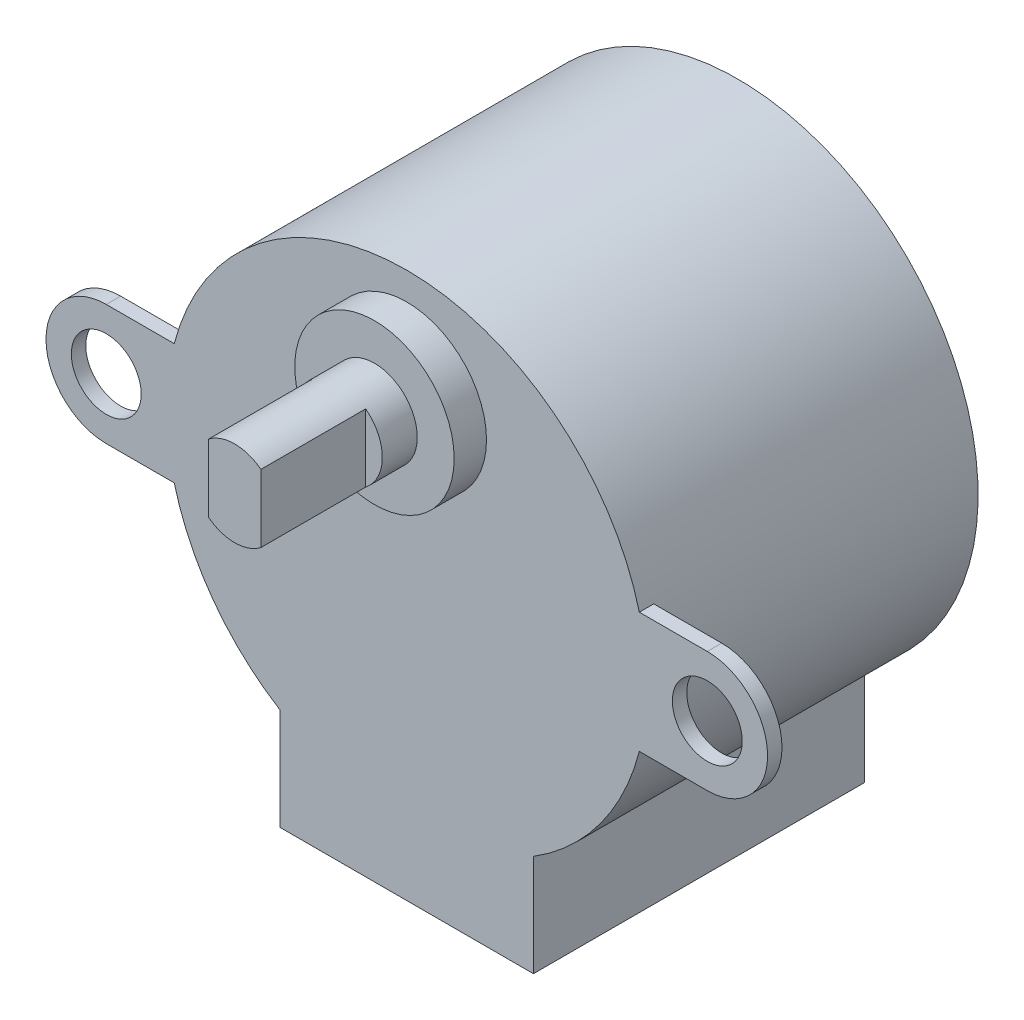
ISO-10303-21;
HEADER;
FILE_DESCRIPTION(('STEP AP214'),'2;1');
FILE_NAME('part.step','',(''),(''),'','','');
FILE_SCHEMA(('AUTOMOTIVE_DESIGN { 1 0 10303 214 1 1 1 1 }'));
ENDSEC;
DATA;
#1=APPLICATION_CONTEXT('core data for automotive mechanical design processes');
#2=APPLICATION_PROTOCOL_DEFINITION('international standard','automotive_design',2000,#1);
#3=PRODUCT_CONTEXT('',#1,'mechanical');
#4=PRODUCT('Part','Part','',(#3));
#5=PRODUCT_RELATED_PRODUCT_CATEGORY('part','',(#4));
#6=PRODUCT_DEFINITION_FORMATION('','',#4);
#7=PRODUCT_DEFINITION_CONTEXT('part definition',#1,'design');
#8=PRODUCT_DEFINITION('design','',#6,#7);
#9=PRODUCT_DEFINITION_SHAPE('','',#8);
#10=(LENGTH_UNIT() NAMED_UNIT(*) SI_UNIT(.MILLI.,.METRE.));
#11=(NAMED_UNIT(*) PLANE_ANGLE_UNIT() SI_UNIT($,.RADIAN.));
#12=(NAMED_UNIT(*) SI_UNIT($,.STERADIAN.) SOLID_ANGLE_UNIT());
#13=UNCERTAINTY_MEASURE_WITH_UNIT(LENGTH_MEASURE(1.E-05),#10,'distance_accuracy_value','');
#14=(GEOMETRIC_REPRESENTATION_CONTEXT(3) GLOBAL_UNCERTAINTY_ASSIGNED_CONTEXT((#13)) GLOBAL_UNIT_ASSIGNED_CONTEXT((#10,
#11,#12)) REPRESENTATION_CONTEXT('',''));
#15=CARTESIAN_POINT('',(0.,0.,0.));
#16=DIRECTION('',(0.,0.,1.));
#17=DIRECTION('',(1.,0.,0.));
#18=AXIS2_PLACEMENT_3D('',#15,#16,#17);
#19=CARTESIAN_POINT('',(7.366,-11.8702545886767,19.2532));
#20=DIRECTION('',(-1.,0.,0.));
#21=DIRECTION('',(0.,-1.,0.));
#22=AXIS2_PLACEMENT_3D('',#19,#20,#21);
#23=PLANE('',#22);
#24=DIRECTION('',(0.,1.,0.));
#25=VECTOR('',#24,1.);
#26=CARTESIAN_POINT('',(7.366,-11.8702545886767,0.));
#27=LINE('',#26,#25);
#28=CARTESIAN_POINT('',(7.366,-17.78,0.));
#29=VERTEX_POINT('',#28);
#30=CARTESIAN_POINT('',(7.36599999999999,-11.8702545886767,0.));
#31=VERTEX_POINT('',#30);
#32=EDGE_CURVE('E251',#29,#31,#27,.T.);
#33=ORIENTED_EDGE('',*,*,#32,.T.);
#34=DIRECTION('',(0.,0.,-1.));
#35=VECTOR('',#34,1.);
#36=CARTESIAN_POINT('',(7.36599999999999,-11.8702545886767,19.2532));
#37=LINE('',#36,#35);
#38=CARTESIAN_POINT('',(7.36599999999999,-11.8702545886767,19.2532));
#39=VERTEX_POINT('',#38);
#40=EDGE_CURVE('E35',#39,#31,#37,.T.);
#41=ORIENTED_EDGE('',*,*,#40,.F.);
#42=DIRECTION('',(0.,1.,0.));
#43=VECTOR('',#42,1.);
#44=CARTESIAN_POINT('',(7.366,-11.8702545886767,19.2532));
#45=LINE('',#44,#43);
#46=CARTESIAN_POINT('',(7.366,-17.78,19.2532));
#47=VERTEX_POINT('',#46);
#48=EDGE_CURVE('E258',#47,#39,#45,.T.);
#49=ORIENTED_EDGE('',*,*,#48,.F.);
#50=DIRECTION('',(0.,0.,-1.));
#51=VECTOR('',#50,1.);
#52=CARTESIAN_POINT('',(7.366,-17.78,19.2532));
#53=LINE('',#52,#51);
#54=EDGE_CURVE('E271',#47,#29,#53,.T.);
#55=ORIENTED_EDGE('',*,*,#54,.T.);
#56=EDGE_LOOP('',(#33,#41,#49,#55));
#57=FACE_BOUND('',#56,.T.);
#58=ADVANCED_FACE('F32',(#57),#23,.F.);
#59=CARTESIAN_POINT('',(0.,0.,19.2532));
#60=DIRECTION('',(0.,0.,-1.));
#61=DIRECTION('',(-1.,0.,0.));
#62=AXIS2_PLACEMENT_3D('',#59,#60,#61);
#63=CYLINDRICAL_SURFACE('',#62,13.97);
#64=CARTESIAN_POINT('',(0.,0.,19.2532));
#65=DIRECTION('',(0.,0.,1.));
#66=DIRECTION('',(1.,0.,0.));
#67=AXIS2_PLACEMENT_3D('',#64,#65,#66);
#68=CIRCLE('',#67,13.97);
#69=CARTESIAN_POINT('',(13.5231088496692,3.5051999999999,19.2532));
#70=VERTEX_POINT('',#69);
#71=CARTESIAN_POINT('',(-13.5231088496692,3.5051999999999,19.2532));
#72=VERTEX_POINT('',#71);
#73=EDGE_CURVE('E267',#70,#72,#68,.T.);
#74=ORIENTED_EDGE('',*,*,#73,.F.);
#75=DIRECTION('',(0.,0.,1.));
#76=VECTOR('',#75,1.);
#77=CARTESIAN_POINT('',(13.5231088496692,3.5051999999999,18.415));
#78=LINE('',#77,#76);
#79=CARTESIAN_POINT('',(13.5231088496692,3.5051999999999,18.415));
#80=VERTEX_POINT('',#79);
#81=EDGE_CURVE('E212',#80,#70,#78,.T.);
#82=ORIENTED_EDGE('',*,*,#81,.F.);
#83=CARTESIAN_POINT('',(0.,0.,18.415));
#84=DIRECTION('',(0.,0.,-1.));
#85=DIRECTION('',(-1.,0.,0.));
#86=AXIS2_PLACEMENT_3D('',#83,#84,#85);
#87=CIRCLE('',#86,13.97);
#88=CARTESIAN_POINT('',(13.5231088496691,-3.5052000000001,18.415));
#89=VERTEX_POINT('',#88);
#90=EDGE_CURVE('E192',#80,#89,#87,.T.);
#91=ORIENTED_EDGE('',*,*,#90,.T.);
#92=DIRECTION('',(0.,0.,1.));
#93=VECTOR('',#92,1.);
#94=CARTESIAN_POINT('',(13.5231088496691,-3.5052000000001,18.415));
#95=LINE('',#94,#93);
#96=CARTESIAN_POINT('',(13.5231088496691,-3.5052000000001,19.2532));
#97=VERTEX_POINT('',#96);
#98=EDGE_CURVE('E205',#89,#97,#95,.T.);
#99=ORIENTED_EDGE('',*,*,#98,.T.);
#100=EDGE_CURVE('E263',#39,#97,#68,.T.);
#101=ORIENTED_EDGE('',*,*,#100,.F.);
#102=ORIENTED_EDGE('',*,*,#40,.T.);
#103=CARTESIAN_POINT('',(0.,0.,0.));
#104=DIRECTION('',(0.,0.,1.));
#105=DIRECTION('',(1.,0.,0.));
#106=AXIS2_PLACEMENT_3D('',#103,#104,#105);
#107=CIRCLE('',#106,13.97);
#108=CARTESIAN_POINT('',(-7.366,-11.8702545886767,0.));
#109=VERTEX_POINT('',#108);
#110=EDGE_CURVE('E274',#31,#109,#107,.T.);
#111=ORIENTED_EDGE('',*,*,#110,.T.);
#112=DIRECTION('',(0.,0.,-1.));
#113=VECTOR('',#112,1.);
#114=CARTESIAN_POINT('',(-7.366,-11.8702545886767,19.2532));
#115=LINE('',#114,#113);
#116=CARTESIAN_POINT('',(-7.366,-11.8702545886767,19.2532));
#117=VERTEX_POINT('',#116);
#118=EDGE_CURVE('E283',#117,#109,#115,.T.);
#119=ORIENTED_EDGE('',*,*,#118,.F.);
#120=CARTESIAN_POINT('',(-13.5231088496691,-3.5052000000001,19.2532));
#121=VERTEX_POINT('',#120);
#122=EDGE_CURVE('E261',#121,#117,#68,.T.);
#123=ORIENTED_EDGE('',*,*,#122,.F.);
#124=DIRECTION('',(0.,0.,1.));
#125=VECTOR('',#124,1.);
#126=CARTESIAN_POINT('',(-13.5231088496691,-3.5052000000001,18.415));
#127=LINE('',#126,#125);
#128=CARTESIAN_POINT('',(-13.5231088496691,-3.5052000000001,18.415));
#129=VERTEX_POINT('',#128);
#130=EDGE_CURVE('E248',#129,#121,#127,.T.);
#131=ORIENTED_EDGE('',*,*,#130,.F.);
#132=CARTESIAN_POINT('',(0.,0.,18.415));
#133=DIRECTION('',(0.,0.,-1.));
#134=DIRECTION('',(1.,0.,0.));
#135=AXIS2_PLACEMENT_3D('',#132,#133,#134);
#136=CIRCLE('',#135,13.97);
#137=CARTESIAN_POINT('',(-13.5231088496692,3.5051999999999,18.415));
#138=VERTEX_POINT('',#137);
#139=EDGE_CURVE('E228',#129,#138,#136,.T.);
#140=ORIENTED_EDGE('',*,*,#139,.T.);
#141=DIRECTION('',(0.,0.,1.));
#142=VECTOR('',#141,1.);
#143=CARTESIAN_POINT('',(-13.5231088496692,3.5051999999999,18.415));
#144=LINE('',#143,#142);
#145=EDGE_CURVE('E241',#138,#72,#144,.T.);
#146=ORIENTED_EDGE('',*,*,#145,.T.);
#147=EDGE_LOOP('',(#74,#82,#91,#99,#101,#102,#111,#119,#123,#131,#140,#146));
#148=FACE_BOUND('',#147,.T.);
#149=ADVANCED_FACE('F293',(#148),#63,.T.);
#150=CARTESIAN_POINT('',(-7.366,-11.8702545886767,19.2532));
#151=DIRECTION('',(1.,0.,0.));
#152=DIRECTION('',(0.,1.,0.));
#153=AXIS2_PLACEMENT_3D('',#150,#151,#152);
#154=PLANE('',#153);
#155=DIRECTION('',(0.,-1.,0.));
#156=VECTOR('',#155,1.);
#157=CARTESIAN_POINT('',(-7.366,-11.8702545886767,0.));
#158=LINE('',#157,#156);
#159=CARTESIAN_POINT('',(-7.366,-17.78,0.));
#160=VERTEX_POINT('',#159);
#161=EDGE_CURVE('E276',#109,#160,#158,.T.);
#162=ORIENTED_EDGE('',*,*,#161,.T.);
#163=DIRECTION('',(0.,0.,-1.));
#164=VECTOR('',#163,1.);
#165=CARTESIAN_POINT('',(-7.366,-17.78,19.2532));
#166=LINE('',#165,#164);
#167=CARTESIAN_POINT('',(-7.366,-17.78,19.2532));
#168=VERTEX_POINT('',#167);
#169=EDGE_CURVE('E281',#168,#160,#166,.T.);
#170=ORIENTED_EDGE('',*,*,#169,.F.);
#171=DIRECTION('',(0.,-1.,0.));
#172=VECTOR('',#171,1.);
#173=CARTESIAN_POINT('',(-7.366,-11.8702545886767,19.2532));
#174=LINE('',#173,#172);
#175=EDGE_CURVE('E266',#117,#168,#174,.T.);
#176=ORIENTED_EDGE('',*,*,#175,.F.);
#177=ORIENTED_EDGE('',*,*,#118,.T.);
#178=EDGE_LOOP('',(#162,#170,#176,#177));
#179=FACE_BOUND('',#178,.T.);
#180=ADVANCED_FACE('F302',(#179),#154,.F.);
#181=CARTESIAN_POINT('',(-7.366,-17.78,19.2532));
#182=DIRECTION('',(0.,1.,0.));
#183=DIRECTION('',(0.,0.,1.));
#184=AXIS2_PLACEMENT_3D('',#181,#182,#183);
#185=PLANE('',#184);
#186=DIRECTION('',(1.,0.,0.));
#187=VECTOR('',#186,1.);
#188=CARTESIAN_POINT('',(-7.366,-17.78,0.));
#189=LINE('',#188,#187);
#190=EDGE_CURVE('E262',#160,#29,#189,.T.);
#191=ORIENTED_EDGE('',*,*,#190,.T.);
#192=ORIENTED_EDGE('',*,*,#54,.F.);
#193=DIRECTION('',(1.,0.,0.));
#194=VECTOR('',#193,1.);
#195=CARTESIAN_POINT('',(-7.366,-17.78,19.2532));
#196=LINE('',#195,#194);
#197=EDGE_CURVE('E269',#168,#47,#196,.T.);
#198=ORIENTED_EDGE('',*,*,#197,.F.);
#199=ORIENTED_EDGE('',*,*,#169,.T.);
#200=EDGE_LOOP('',(#191,#192,#198,#199));
#201=FACE_BOUND('',#200,.T.);
#202=ADVANCED_FACE('F305',(#201),#185,.F.);
#203=CARTESIAN_POINT('',(0.,0.,19.2532));
#204=DIRECTION('',(0.,0.,1.));
#205=DIRECTION('',(1.,0.,0.));
#206=AXIS2_PLACEMENT_3D('',#203,#204,#205);
#207=PLANE('',#206);
#208=CARTESIAN_POINT('',(0.,7.7343,19.2532));
#209=DIRECTION('',(0.,0.,1.));
#210=DIRECTION('',(1.,0.,0.));
#211=AXIS2_PLACEMENT_3D('',#208,#209,#210);
#212=CIRCLE('',#211,4.6355);
#213=CARTESIAN_POINT('',(4.6355,7.7343,19.2532));
#214=VERTEX_POINT('',#213);
#215=EDGE_CURVE('E178',#214,#214,#212,.T.);
#216=ORIENTED_EDGE('',*,*,#215,.F.);
#217=EDGE_LOOP('',(#216));
#218=FACE_BOUND('',#217,.T.);
#219=ORIENTED_EDGE('',*,*,#48,.T.);
#220=ORIENTED_EDGE('',*,*,#100,.T.);
#221=DIRECTION('',(1.,0.,0.));
#222=VECTOR('',#221,1.);
#223=CARTESIAN_POINT('',(13.5231088496691,-3.5052000000001,19.2532));
#224=LINE('',#223,#222);
#225=CARTESIAN_POINT('',(17.4752,-3.5052000000001,19.2532));
#226=VERTEX_POINT('',#225);
#227=EDGE_CURVE('E189',#97,#226,#224,.T.);
#228=ORIENTED_EDGE('',*,*,#227,.T.);
#229=CARTESIAN_POINT('',(17.4752,0.,19.2532));
#230=DIRECTION('',(0.,0.,1.));
#231=DIRECTION('',(-1.,0.,0.));
#232=AXIS2_PLACEMENT_3D('',#229,#230,#231);
#233=CIRCLE('',#232,3.5052);
#234=CARTESIAN_POINT('',(17.4752,3.5051999999999,19.2532));
#235=VERTEX_POINT('',#234);
#236=EDGE_CURVE('E208',#226,#235,#233,.T.);
#237=ORIENTED_EDGE('',*,*,#236,.T.);
#238=DIRECTION('',(-1.,0.,0.));
#239=VECTOR('',#238,1.);
#240=CARTESIAN_POINT('',(13.5231088496692,3.5051999999999,19.2532));
#241=LINE('',#240,#239);
#242=EDGE_CURVE('E196',#235,#70,#241,.T.);
#243=ORIENTED_EDGE('',*,*,#242,.T.);
#244=ORIENTED_EDGE('',*,*,#73,.T.);
#245=DIRECTION('',(-1.,0.,0.));
#246=VECTOR('',#245,1.);
#247=CARTESIAN_POINT('',(-13.5231088496692,3.5051999999999,19.2532));
#248=LINE('',#247,#246);
#249=CARTESIAN_POINT('',(-17.4752,3.5051999999999,19.2532));
#250=VERTEX_POINT('',#249);
#251=EDGE_CURVE('E225',#72,#250,#248,.T.);
#252=ORIENTED_EDGE('',*,*,#251,.T.);
#253=CARTESIAN_POINT('',(-17.4752,0.,19.2532));
#254=DIRECTION('',(0.,0.,1.));
#255=DIRECTION('',(1.,0.,0.));
#256=AXIS2_PLACEMENT_3D('',#253,#254,#255);
#257=CIRCLE('',#256,3.5052);
#258=CARTESIAN_POINT('',(-17.4752,-3.5052000000001,19.2532));
#259=VERTEX_POINT('',#258);
#260=EDGE_CURVE('E244',#250,#259,#257,.T.);
#261=ORIENTED_EDGE('',*,*,#260,.T.);
#262=DIRECTION('',(1.,0.,0.));
#263=VECTOR('',#262,1.);
#264=CARTESIAN_POINT('',(-13.5231088496691,-3.5052000000001,19.2532));
#265=LINE('',#264,#263);
#266=EDGE_CURVE('E232',#259,#121,#265,.T.);
#267=ORIENTED_EDGE('',*,*,#266,.T.);
#268=ORIENTED_EDGE('',*,*,#122,.T.);
#269=ORIENTED_EDGE('',*,*,#175,.T.);
#270=ORIENTED_EDGE('',*,*,#197,.T.);
#271=EDGE_LOOP('',(#219,#220,#228,#237,#243,#244,#252,#261,#267,#268,#269,#270));
#272=FACE_BOUND('',#271,.T.);
#273=CARTESIAN_POINT('',(-17.4752,0.,19.2532));
#274=DIRECTION('',(0.,0.,1.));
#275=DIRECTION('',(1.,0.,0.));
#276=AXIS2_PLACEMENT_3D('',#273,#274,#275);
#277=CIRCLE('',#276,2.032);
#278=CARTESIAN_POINT('',(-15.4432,0.,19.2532));
#279=VERTEX_POINT('',#278);
#280=EDGE_CURVE('E215',#279,#279,#277,.T.);
#281=ORIENTED_EDGE('',*,*,#280,.F.);
#282=EDGE_LOOP('',(#281));
#283=FACE_BOUND('',#282,.T.);
#284=CARTESIAN_POINT('',(17.4752,0.,19.2532));
#285=DIRECTION('',(0.,0.,1.));
#286=DIRECTION('',(-1.,0.,0.));
#287=AXIS2_PLACEMENT_3D('',#284,#285,#286);
#288=CIRCLE('',#287,2.032);
#289=CARTESIAN_POINT('',(15.4432,0.,19.2532));
#290=VERTEX_POINT('',#289);
#291=EDGE_CURVE('E183',#290,#290,#288,.T.);
#292=ORIENTED_EDGE('',*,*,#291,.F.);
#293=EDGE_LOOP('',(#292));
#294=FACE_BOUND('',#293,.T.);
#295=ADVANCED_FACE('F307',(#218,#272,#283,#294),#207,.T.);
#296=CARTESIAN_POINT('',(0.,0.,0.));
#297=DIRECTION('',(0.,0.,1.));
#298=DIRECTION('',(1.,0.,0.));
#299=AXIS2_PLACEMENT_3D('',#296,#297,#298);
#300=PLANE('',#299);
#301=ORIENTED_EDGE('',*,*,#32,.F.);
#302=ORIENTED_EDGE('',*,*,#190,.F.);
#303=ORIENTED_EDGE('',*,*,#161,.F.);
#304=ORIENTED_EDGE('',*,*,#110,.F.);
#305=EDGE_LOOP('',(#301,#302,#303,#304));
#306=FACE_BOUND('',#305,.T.);
#307=ADVANCED_FACE('F300',(#306),#300,.F.);
#308=CARTESIAN_POINT('',(-13.5231088496691,-3.5052000000001,18.415));
#309=DIRECTION('',(0.,-1.,0.));
#310=DIRECTION('',(1.,0.,0.));
#311=AXIS2_PLACEMENT_3D('',#308,#309,#310);
#312=PLANE('',#311);
#313=ORIENTED_EDGE('',*,*,#266,.F.);
#314=DIRECTION('',(0.,0.,1.));
#315=VECTOR('',#314,1.);
#316=CARTESIAN_POINT('',(-17.4752,-3.5052000000001,18.415));
#317=LINE('',#316,#315);
#318=CARTESIAN_POINT('',(-17.4752,-3.5052000000001,18.415));
#319=VERTEX_POINT('',#318);
#320=EDGE_CURVE('E252',#319,#259,#317,.T.);
#321=ORIENTED_EDGE('',*,*,#320,.F.);
#322=DIRECTION('',(1.,0.,0.));
#323=VECTOR('',#322,1.);
#324=CARTESIAN_POINT('',(-13.5231088496691,-3.5052000000001,18.415));
#325=LINE('',#324,#323);
#326=EDGE_CURVE('E238',#319,#129,#325,.T.);
#327=ORIENTED_EDGE('',*,*,#326,.T.);
#328=ORIENTED_EDGE('',*,*,#130,.T.);
#329=EDGE_LOOP('',(#313,#321,#327,#328));
#330=FACE_BOUND('',#329,.T.);
#331=ADVANCED_FACE('F324',(#330),#312,.T.);
#332=CARTESIAN_POINT('',(-17.4752,0.,18.415));
#333=DIRECTION('',(0.,0.,1.));
#334=DIRECTION('',(1.,0.,0.));
#335=AXIS2_PLACEMENT_3D('',#332,#333,#334);
#336=CYLINDRICAL_SURFACE('',#335,3.5052);
#337=ORIENTED_EDGE('',*,*,#260,.F.);
#338=DIRECTION('',(0.,0.,1.));
#339=VECTOR('',#338,1.);
#340=CARTESIAN_POINT('',(-17.4752,3.5051999999999,18.415));
#341=LINE('',#340,#339);
#342=CARTESIAN_POINT('',(-17.4752,3.5051999999999,18.415));
#343=VERTEX_POINT('',#342);
#344=EDGE_CURVE('E254',#343,#250,#341,.T.);
#345=ORIENTED_EDGE('',*,*,#344,.F.);
#346=CARTESIAN_POINT('',(-17.4752,0.,18.415));
#347=DIRECTION('',(0.,0.,1.));
#348=DIRECTION('',(1.,0.,0.));
#349=AXIS2_PLACEMENT_3D('',#346,#347,#348);
#350=CIRCLE('',#349,3.5052);
#351=EDGE_CURVE('E235',#343,#319,#350,.T.);
#352=ORIENTED_EDGE('',*,*,#351,.T.);
#353=ORIENTED_EDGE('',*,*,#320,.T.);
#354=EDGE_LOOP('',(#337,#345,#352,#353));
#355=FACE_BOUND('',#354,.T.);
#356=ADVANCED_FACE('F326',(#355),#336,.T.);
#357=CARTESIAN_POINT('',(-13.5231088496692,3.5051999999999,18.415));
#358=DIRECTION('',(0.,1.,0.));
#359=DIRECTION('',(-1.,0.,0.));
#360=AXIS2_PLACEMENT_3D('',#357,#358,#359);
#361=PLANE('',#360);
#362=ORIENTED_EDGE('',*,*,#251,.F.);
#363=ORIENTED_EDGE('',*,*,#145,.F.);
#364=DIRECTION('',(-1.,0.,0.));
#365=VECTOR('',#364,1.);
#366=CARTESIAN_POINT('',(-13.5231088496692,3.5051999999999,18.415));
#367=LINE('',#366,#365);
#368=EDGE_CURVE('E231',#138,#343,#367,.T.);
#369=ORIENTED_EDGE('',*,*,#368,.T.);
#370=ORIENTED_EDGE('',*,*,#344,.T.);
#371=EDGE_LOOP('',(#362,#363,#369,#370));
#372=FACE_BOUND('',#371,.T.);
#373=ADVANCED_FACE('F316',(#372),#361,.T.);
#374=CARTESIAN_POINT('',(0.,0.,18.415));
#375=DIRECTION('',(0.,0.,1.));
#376=DIRECTION('',(1.,0.,0.));
#377=AXIS2_PLACEMENT_3D('',#374,#375,#376);
#378=PLANE('',#377);
#379=CARTESIAN_POINT('',(-17.4752,0.,18.415));
#380=DIRECTION('',(0.,0.,1.));
#381=DIRECTION('',(1.,0.,0.));
#382=AXIS2_PLACEMENT_3D('',#379,#380,#381);
#383=CIRCLE('',#382,2.032);
#384=CARTESIAN_POINT('',(-15.4432,0.,18.415));
#385=VERTEX_POINT('',#384);
#386=EDGE_CURVE('E222',#385,#385,#383,.T.);
#387=ORIENTED_EDGE('',*,*,#386,.T.);
#388=EDGE_LOOP('',(#387));
#389=FACE_BOUND('',#388,.T.);
#390=ORIENTED_EDGE('',*,*,#139,.F.);
#391=ORIENTED_EDGE('',*,*,#326,.F.);
#392=ORIENTED_EDGE('',*,*,#351,.F.);
#393=ORIENTED_EDGE('',*,*,#368,.F.);
#394=EDGE_LOOP('',(#390,#391,#392,#393));
#395=FACE_BOUND('',#394,.T.);
#396=ADVANCED_FACE('F321',(#389,#395),#378,.F.);
#397=CARTESIAN_POINT('',(-17.4752,0.,18.415));
#398=DIRECTION('',(0.,0.,1.));
#399=DIRECTION('',(1.,0.,0.));
#400=AXIS2_PLACEMENT_3D('',#397,#398,#399);
#401=CYLINDRICAL_SURFACE('',#400,2.032);
#402=ORIENTED_EDGE('',*,*,#386,.F.);
#403=EDGE_LOOP('',(#402));
#404=FACE_BOUND('',#403,.T.);
#405=ORIENTED_EDGE('',*,*,#280,.T.);
#406=EDGE_LOOP('',(#405));
#407=FACE_BOUND('',#406,.T.);
#408=ADVANCED_FACE('F380',(#404,#407),#401,.F.);
#409=CARTESIAN_POINT('',(13.5231088496692,3.5051999999999,18.415));
#410=DIRECTION('',(0.,1.,0.));
#411=DIRECTION('',(-1.,0.,0.));
#412=AXIS2_PLACEMENT_3D('',#409,#410,#411);
#413=PLANE('',#412);
#414=ORIENTED_EDGE('',*,*,#242,.F.);
#415=DIRECTION('',(0.,0.,1.));
#416=VECTOR('',#415,1.);
#417=CARTESIAN_POINT('',(17.4752,3.5051999999999,18.415));
#418=LINE('',#417,#416);
#419=CARTESIAN_POINT('',(17.4752,3.5051999999999,18.415));
#420=VERTEX_POINT('',#419);
#421=EDGE_CURVE('E216',#420,#235,#418,.T.);
#422=ORIENTED_EDGE('',*,*,#421,.F.);
#423=DIRECTION('',(-1.,0.,0.));
#424=VECTOR('',#423,1.);
#425=CARTESIAN_POINT('',(13.5231088496692,3.5051999999999,18.415));
#426=LINE('',#425,#424);
#427=EDGE_CURVE('E202',#420,#80,#426,.T.);
#428=ORIENTED_EDGE('',*,*,#427,.T.);
#429=ORIENTED_EDGE('',*,*,#81,.T.);
#430=EDGE_LOOP('',(#414,#422,#428,#429));
#431=FACE_BOUND('',#430,.T.);
#432=ADVANCED_FACE('F376',(#431),#413,.T.);
#433=CARTESIAN_POINT('',(17.4752,0.,18.415));
#434=DIRECTION('',(0.,0.,1.));
#435=DIRECTION('',(1.,0.,0.));
#436=AXIS2_PLACEMENT_3D('',#433,#434,#435);
#437=CYLINDRICAL_SURFACE('',#436,3.5052);
#438=ORIENTED_EDGE('',*,*,#236,.F.);
#439=DIRECTION('',(0.,0.,1.));
#440=VECTOR('',#439,1.);
#441=CARTESIAN_POINT('',(17.4752,-3.5052000000001,18.415));
#442=LINE('',#441,#440);
#443=CARTESIAN_POINT('',(17.4752,-3.5052000000001,18.415));
#444=VERTEX_POINT('',#443);
#445=EDGE_CURVE('E218',#444,#226,#442,.T.);
#446=ORIENTED_EDGE('',*,*,#445,.F.);
#447=CARTESIAN_POINT('',(17.4752,0.,18.415));
#448=DIRECTION('',(0.,0.,1.));
#449=DIRECTION('',(-1.,0.,0.));
#450=AXIS2_PLACEMENT_3D('',#447,#448,#449);
#451=CIRCLE('',#450,3.5052);
#452=EDGE_CURVE('E199',#444,#420,#451,.T.);
#453=ORIENTED_EDGE('',*,*,#452,.T.);
#454=ORIENTED_EDGE('',*,*,#421,.T.);
#455=EDGE_LOOP('',(#438,#446,#453,#454));
#456=FACE_BOUND('',#455,.T.);
#457=ADVANCED_FACE('F379',(#456),#437,.T.);
#458=CARTESIAN_POINT('',(13.5231088496691,-3.5052000000001,18.415));
#459=DIRECTION('',(0.,-1.,0.));
#460=DIRECTION('',(1.,0.,0.));
#461=AXIS2_PLACEMENT_3D('',#458,#459,#460);
#462=PLANE('',#461);
#463=ORIENTED_EDGE('',*,*,#227,.F.);
#464=ORIENTED_EDGE('',*,*,#98,.F.);
#465=DIRECTION('',(1.,0.,0.));
#466=VECTOR('',#465,1.);
#467=CARTESIAN_POINT('',(13.5231088496691,-3.5052000000001,18.415));
#468=LINE('',#467,#466);
#469=EDGE_CURVE('E195',#89,#444,#468,.T.);
#470=ORIENTED_EDGE('',*,*,#469,.T.);
#471=ORIENTED_EDGE('',*,*,#445,.T.);
#472=EDGE_LOOP('',(#463,#464,#470,#471));
#473=FACE_BOUND('',#472,.T.);
#474=ADVANCED_FACE('F374',(#473),#462,.T.);
#475=CARTESIAN_POINT('',(0.,0.,18.415));
#476=DIRECTION('',(0.,0.,-1.));
#477=DIRECTION('',(-1.,0.,0.));
#478=AXIS2_PLACEMENT_3D('',#475,#476,#477);
#479=PLANE('',#478);
#480=CARTESIAN_POINT('',(17.4752,0.,18.415));
#481=DIRECTION('',(0.,0.,1.));
#482=DIRECTION('',(-1.,0.,0.));
#483=AXIS2_PLACEMENT_3D('',#480,#481,#482);
#484=CIRCLE('',#483,2.032);
#485=CARTESIAN_POINT('',(15.4432,0.,18.415));
#486=VERTEX_POINT('',#485);
#487=EDGE_CURVE('E186',#486,#486,#484,.T.);
#488=ORIENTED_EDGE('',*,*,#487,.T.);
#489=EDGE_LOOP('',(#488));
#490=FACE_BOUND('',#489,.T.);
#491=ORIENTED_EDGE('',*,*,#90,.F.);
#492=ORIENTED_EDGE('',*,*,#427,.F.);
#493=ORIENTED_EDGE('',*,*,#452,.F.);
#494=ORIENTED_EDGE('',*,*,#469,.F.);
#495=EDGE_LOOP('',(#491,#492,#493,#494));
#496=FACE_BOUND('',#495,.T.);
#497=ADVANCED_FACE('F366',(#490,#496),#479,.T.);
#498=CARTESIAN_POINT('',(17.4752,0.,18.415));
#499=DIRECTION('',(0.,0.,1.));
#500=DIRECTION('',(1.,0.,0.));
#501=AXIS2_PLACEMENT_3D('',#498,#499,#500);
#502=CYLINDRICAL_SURFACE('',#501,2.032);
#503=ORIENTED_EDGE('',*,*,#487,.F.);
#504=EDGE_LOOP('',(#503));
#505=FACE_BOUND('',#504,.T.);
#506=ORIENTED_EDGE('',*,*,#291,.T.);
#507=EDGE_LOOP('',(#506));
#508=FACE_BOUND('',#507,.T.);
#509=ADVANCED_FACE('F357',(#505,#508),#502,.F.);
#510=CARTESIAN_POINT('',(0.,7.7343,21.1328));
#511=DIRECTION('',(0.,0.,-1.));
#512=DIRECTION('',(-1.,0.,0.));
#513=AXIS2_PLACEMENT_3D('',#510,#511,#512);
#514=CYLINDRICAL_SURFACE('',#513,4.6355);
#515=CARTESIAN_POINT('',(0.,7.7343,21.1328));
#516=DIRECTION('',(0.,0.,1.));
#517=DIRECTION('',(1.,0.,0.));
#518=AXIS2_PLACEMENT_3D('',#515,#516,#517);
#519=CIRCLE('',#518,4.6355);
#520=CARTESIAN_POINT('',(4.6355,7.7343,21.1328));
#521=VERTEX_POINT('',#520);
#522=EDGE_CURVE('E180',#521,#521,#519,.T.);
#523=ORIENTED_EDGE('',*,*,#522,.F.);
#524=EDGE_LOOP('',(#523));
#525=FACE_BOUND('',#524,.T.);
#526=ORIENTED_EDGE('',*,*,#215,.T.);
#527=EDGE_LOOP('',(#526));
#528=FACE_BOUND('',#527,.T.);
#529=ADVANCED_FACE('F354',(#525,#528),#514,.T.);
#530=CARTESIAN_POINT('',(0.,7.7343,21.1328));
#531=DIRECTION('',(0.,0.,1.));
#532=DIRECTION('',(1.,0.,0.));
#533=AXIS2_PLACEMENT_3D('',#530,#531,#532);
#534=PLANE('',#533);
#535=CARTESIAN_POINT('',(0.,7.7343,21.1328));
#536=DIRECTION('',(0.,0.,1.));
#537=DIRECTION('',(1.,0.,0.));
#538=AXIS2_PLACEMENT_3D('',#535,#536,#537);
#539=CIRCLE('',#538,2.4892);
#540=CARTESIAN_POINT('',(2.4892,7.7343,21.1328));
#541=VERTEX_POINT('',#540);
#542=EDGE_CURVE('E11',#541,#541,#539,.T.);
#543=ORIENTED_EDGE('',*,*,#542,.F.);
#544=EDGE_LOOP('',(#543));
#545=FACE_BOUND('',#544,.T.);
#546=ORIENTED_EDGE('',*,*,#522,.T.);
#547=EDGE_LOOP('',(#546));
#548=FACE_BOUND('',#547,.T.);
#549=ADVANCED_FACE('F356',(#545,#548),#534,.T.);
#550=CARTESIAN_POINT('',(0.,7.7343,29.2608));
#551=DIRECTION('',(0.,0.,-1.));
#552=DIRECTION('',(-1.,0.,0.));
#553=AXIS2_PLACEMENT_3D('',#550,#551,#552);
#554=CYLINDRICAL_SURFACE('',#553,2.4892);
#555=CARTESIAN_POINT('',(0.,7.7343,29.2608));
#556=DIRECTION('',(0.,0.,1.));
#557=DIRECTION('',(1.,0.,0.));
#558=AXIS2_PLACEMENT_3D('',#555,#556,#557);
#559=CIRCLE('',#558,2.4892);
#560=CARTESIAN_POINT('',(1.524,9.70243125578555,29.2608));
#561=VERTEX_POINT('',#560);
#562=CARTESIAN_POINT('',(-1.524,9.70243125578555,29.2608));
#563=VERTEX_POINT('',#562);
#564=EDGE_CURVE('E162',#561,#563,#559,.T.);
#565=ORIENTED_EDGE('',*,*,#564,.F.);
#566=DIRECTION('',(0.,0.,1.));
#567=VECTOR('',#566,1.);
#568=CARTESIAN_POINT('',(1.524,9.70243125578555,23.1648));
#569=LINE('',#568,#567);
#570=CARTESIAN_POINT('',(1.524,9.70243125578555,23.1648));
#571=VERTEX_POINT('',#570);
#572=EDGE_CURVE('E55',#571,#561,#569,.T.);
#573=ORIENTED_EDGE('',*,*,#572,.F.);
#574=CARTESIAN_POINT('',(0.,7.7343,23.1648));
#575=DIRECTION('',(0.,0.,1.));
#576=DIRECTION('',(-1.,0.,0.));
#577=AXIS2_PLACEMENT_3D('',#574,#575,#576);
#578=CIRCLE('',#577,2.4892);
#579=CARTESIAN_POINT('',(1.524,5.76616874421445,23.1648));
#580=VERTEX_POINT('',#579);
#581=EDGE_CURVE('E147',#580,#571,#578,.T.);
#582=ORIENTED_EDGE('',*,*,#581,.F.);
#583=DIRECTION('',(0.,0.,1.));
#584=VECTOR('',#583,1.);
#585=CARTESIAN_POINT('',(1.524,5.76616874421445,23.1648));
#586=LINE('',#585,#584);
#587=CARTESIAN_POINT('',(1.524,5.76616874421445,29.2608));
#588=VERTEX_POINT('',#587);
#589=EDGE_CURVE('E155',#580,#588,#586,.T.);
#590=ORIENTED_EDGE('',*,*,#589,.T.);
#591=CARTESIAN_POINT('',(-1.524,5.76616874421445,29.2608));
#592=VERTEX_POINT('',#591);
#593=EDGE_CURVE('E164',#592,#588,#559,.T.);
#594=ORIENTED_EDGE('',*,*,#593,.F.);
#595=DIRECTION('',(0.,0.,1.));
#596=VECTOR('',#595,1.);
#597=CARTESIAN_POINT('',(-1.524,5.76616874421445,23.1648));
#598=LINE('',#597,#596);
#599=CARTESIAN_POINT('',(-1.524,5.76616874421445,23.1648));
#600=VERTEX_POINT('',#599);
#601=EDGE_CURVE('E47',#600,#592,#598,.T.);
#602=ORIENTED_EDGE('',*,*,#601,.F.);
#603=CARTESIAN_POINT('',(0.,7.7343,23.1648));
#604=DIRECTION('',(0.,0.,1.));
#605=DIRECTION('',(1.,0.,0.));
#606=AXIS2_PLACEMENT_3D('',#603,#604,#605);
#607=CIRCLE('',#606,2.4892);
#608=CARTESIAN_POINT('',(-1.524,9.70243125578555,23.1648));
#609=VERTEX_POINT('',#608);
#610=EDGE_CURVE('E168',#609,#600,#607,.T.);
#611=ORIENTED_EDGE('',*,*,#610,.F.);
#612=DIRECTION('',(0.,0.,1.));
#613=VECTOR('',#612,1.);
#614=CARTESIAN_POINT('',(-1.524,9.70243125578555,23.1648));
#615=LINE('',#614,#613);
#616=EDGE_CURVE('E175',#609,#563,#615,.T.);
#617=ORIENTED_EDGE('',*,*,#616,.T.);
#618=EDGE_LOOP('',(#565,#573,#582,#590,#594,#602,#611,#617));
#619=FACE_BOUND('',#618,.T.);
#620=ORIENTED_EDGE('',*,*,#542,.T.);
#621=EDGE_LOOP('',(#620));
#622=FACE_BOUND('',#621,.T.);
#623=ADVANCED_FACE('F158',(#619,#622),#554,.T.);
#624=CARTESIAN_POINT('',(0.,7.7343,29.2608));
#625=DIRECTION('',(0.,0.,1.));
#626=DIRECTION('',(1.,0.,0.));
#627=AXIS2_PLACEMENT_3D('',#624,#625,#626);
#628=PLANE('',#627);
#629=DIRECTION('',(0.,-1.,0.));
#630=VECTOR('',#629,1.);
#631=CARTESIAN_POINT('',(1.524,9.70243125578555,29.2608));
#632=LINE('',#631,#630);
#633=EDGE_CURVE('E152',#561,#588,#632,.T.);
#634=ORIENTED_EDGE('',*,*,#633,.F.);
#635=ORIENTED_EDGE('',*,*,#564,.T.);
#636=DIRECTION('',(0.,1.,0.));
#637=VECTOR('',#636,1.);
#638=CARTESIAN_POINT('',(-1.524,9.70243125578555,29.2608));
#639=LINE('',#638,#637);
#640=EDGE_CURVE('E171',#592,#563,#639,.T.);
#641=ORIENTED_EDGE('',*,*,#640,.F.);
#642=ORIENTED_EDGE('',*,*,#593,.T.);
#643=EDGE_LOOP('',(#634,#635,#641,#642));
#644=FACE_BOUND('',#643,.T.);
#645=ADVANCED_FACE('F452',(#644),#628,.T.);
#646=CARTESIAN_POINT('',(-1.524,9.70243125578555,23.1648));
#647=DIRECTION('',(1.,0.,0.));
#648=DIRECTION('',(0.,1.,0.));
#649=AXIS2_PLACEMENT_3D('',#646,#647,#648);
#650=PLANE('',#649);
#651=ORIENTED_EDGE('',*,*,#640,.T.);
#652=ORIENTED_EDGE('',*,*,#616,.F.);
#653=DIRECTION('',(0.,1.,0.));
#654=VECTOR('',#653,1.);
#655=CARTESIAN_POINT('',(-1.524,9.70243125578555,23.1648));
#656=LINE('',#655,#654);
#657=EDGE_CURVE('E170',#600,#609,#656,.T.);
#658=ORIENTED_EDGE('',*,*,#657,.F.);
#659=ORIENTED_EDGE('',*,*,#601,.T.);
#660=EDGE_LOOP('',(#651,#652,#658,#659));
#661=FACE_BOUND('',#660,.T.);
#662=ADVANCED_FACE('F460',(#661),#650,.F.);
#663=CARTESIAN_POINT('',(0.,7.7343,23.1648));
#664=DIRECTION('',(0.,0.,1.));
#665=DIRECTION('',(1.,0.,0.));
#666=AXIS2_PLACEMENT_3D('',#663,#664,#665);
#667=PLANE('',#666);
#668=ORIENTED_EDGE('',*,*,#610,.T.);
#669=ORIENTED_EDGE('',*,*,#657,.T.);
#670=EDGE_LOOP('',(#668,#669));
#671=FACE_BOUND('',#670,.T.);
#672=ADVANCED_FACE('F470',(#671),#667,.T.);
#673=CARTESIAN_POINT('',(1.524,9.70243125578555,23.1648));
#674=DIRECTION('',(-1.,0.,0.));
#675=DIRECTION('',(0.,-1.,0.));
#676=AXIS2_PLACEMENT_3D('',#673,#674,#675);
#677=PLANE('',#676);
#678=ORIENTED_EDGE('',*,*,#633,.T.);
#679=ORIENTED_EDGE('',*,*,#589,.F.);
#680=DIRECTION('',(0.,-1.,0.));
#681=VECTOR('',#680,1.);
#682=CARTESIAN_POINT('',(1.524,9.70243125578555,23.1648));
#683=LINE('',#682,#681);
#684=EDGE_CURVE('E149',#571,#580,#683,.T.);
#685=ORIENTED_EDGE('',*,*,#684,.F.);
#686=ORIENTED_EDGE('',*,*,#572,.T.);
#687=EDGE_LOOP('',(#678,#679,#685,#686));
#688=FACE_BOUND('',#687,.T.);
#689=ADVANCED_FACE('F154',(#688),#677,.F.);
#690=CARTESIAN_POINT('',(0.,7.7343,23.1648));
#691=DIRECTION('',(0.,0.,-1.));
#692=DIRECTION('',(-1.,0.,0.));
#693=AXIS2_PLACEMENT_3D('',#690,#691,#692);
#694=PLANE('',#693);
#695=ORIENTED_EDGE('',*,*,#581,.T.);
#696=ORIENTED_EDGE('',*,*,#684,.T.);
#697=EDGE_LOOP('',(#695,#696));
#698=FACE_BOUND('',#697,.T.);
#699=ADVANCED_FACE('F148',(#698),#694,.F.);
#700=CLOSED_SHELL('',(#58,#149,#180,#202,#295,#307,#331,#356,#373,#396,#408,#432,#457,#474,#497,
#509,#529,#549,#623,#645,#662,#672,#689,#699));
#701=MANIFOLD_SOLID_BREP('B2',#700);
#702=ADVANCED_BREP_SHAPE_REPRESENTATION('',(#18,#701),#14);
#703=SHAPE_DEFINITION_REPRESENTATION(#9,#702);
ENDSEC;
END-ISO-10303-21;
